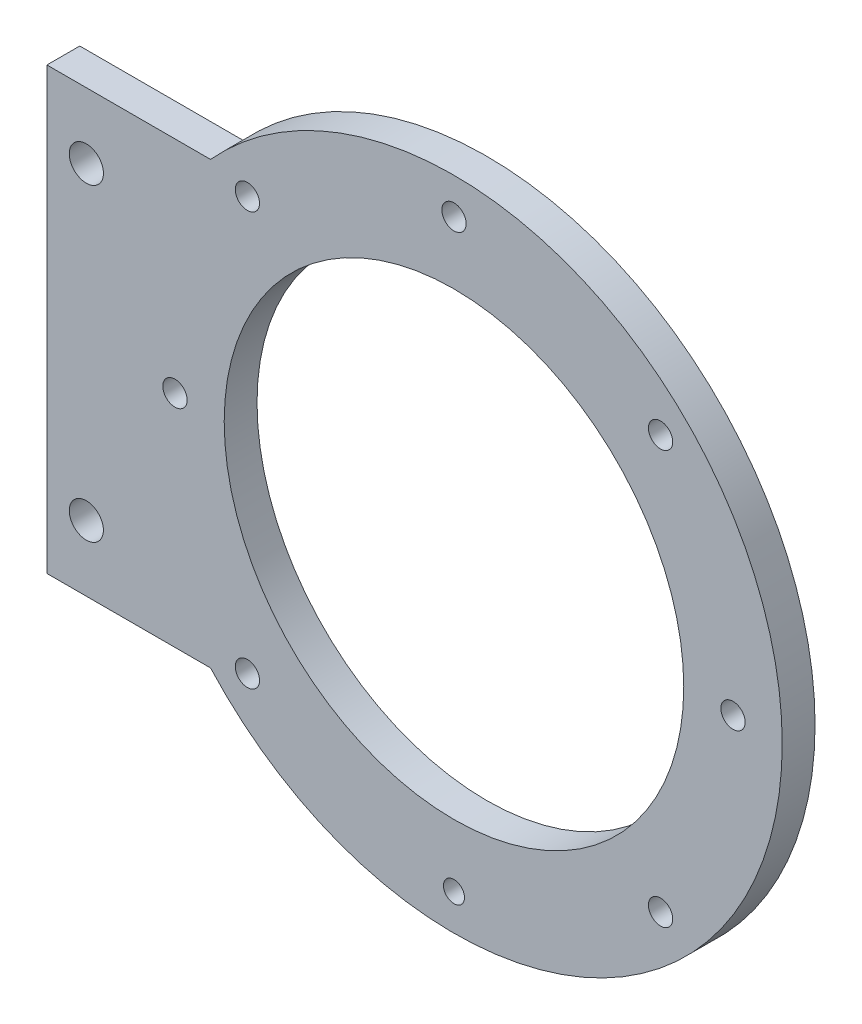
ISO-10303-21;
HEADER;
FILE_DESCRIPTION(('STEP AP214'),'2;1');
FILE_NAME('part.step','',(''),(''),'','','');
FILE_SCHEMA(('AUTOMOTIVE_DESIGN { 1 0 10303 214 1 1 1 1 }'));
ENDSEC;
DATA;
#1=APPLICATION_CONTEXT('core data for automotive mechanical design processes');
#2=APPLICATION_PROTOCOL_DEFINITION('international standard','automotive_design',2000,#1);
#3=PRODUCT_CONTEXT('',#1,'mechanical');
#4=PRODUCT('Part','Part','',(#3));
#5=PRODUCT_RELATED_PRODUCT_CATEGORY('part','',(#4));
#6=PRODUCT_DEFINITION_FORMATION('','',#4);
#7=PRODUCT_DEFINITION_CONTEXT('part definition',#1,'design');
#8=PRODUCT_DEFINITION('design','',#6,#7);
#9=PRODUCT_DEFINITION_SHAPE('','',#8);
#10=(LENGTH_UNIT() NAMED_UNIT(*) SI_UNIT(.MILLI.,.METRE.));
#11=(NAMED_UNIT(*) PLANE_ANGLE_UNIT() SI_UNIT($,.RADIAN.));
#12=(NAMED_UNIT(*) SI_UNIT($,.STERADIAN.) SOLID_ANGLE_UNIT());
#13=UNCERTAINTY_MEASURE_WITH_UNIT(LENGTH_MEASURE(1.E-05),#10,'distance_accuracy_value','');
#14=(GEOMETRIC_REPRESENTATION_CONTEXT(3) GLOBAL_UNCERTAINTY_ASSIGNED_CONTEXT((#13)) GLOBAL_UNIT_ASSIGNED_CONTEXT((#10,
#11,#12)) REPRESENTATION_CONTEXT('',''));
#15=CARTESIAN_POINT('',(0.,0.,0.));
#16=DIRECTION('',(0.,0.,1.));
#17=DIRECTION('',(1.,0.,0.));
#18=AXIS2_PLACEMENT_3D('',#15,#16,#17);
#19=CARTESIAN_POINT('',(0.,0.,5.));
#20=DIRECTION('',(0.,1.,0.));
#21=DIRECTION('',(0.,0.,1.));
#22=AXIS2_PLACEMENT_3D('',#19,#20,#21);
#23=PLANE('',#22);
#24=DIRECTION('',(1.,0.,0.));
#25=VECTOR('',#24,1.);
#26=CARTESIAN_POINT('',(0.,0.,0.));
#27=LINE('',#26,#25);
#28=CARTESIAN_POINT('',(-12.,0.,0.));
#29=VERTEX_POINT('',#28);
#30=CARTESIAN_POINT('',(12.9190075645217,0.,0.));
#31=VERTEX_POINT('',#30);
#32=EDGE_CURVE('E117',#29,#31,#27,.T.);
#33=ORIENTED_EDGE('',*,*,#32,.F.);
#34=DIRECTION('',(0.,0.,-1.));
#35=VECTOR('',#34,1.);
#36=CARTESIAN_POINT('',(-12.,0.,5.));
#37=LINE('',#36,#35);
#38=CARTESIAN_POINT('',(-12.,0.,5.));
#39=VERTEX_POINT('',#38);
#40=EDGE_CURVE('E11',#39,#29,#37,.T.);
#41=ORIENTED_EDGE('',*,*,#40,.F.);
#42=DIRECTION('',(1.,0.,0.));
#43=VECTOR('',#42,1.);
#44=CARTESIAN_POINT('',(0.,0.,5.));
#45=LINE('',#44,#43);
#46=CARTESIAN_POINT('',(12.9190075645217,0.,5.));
#47=VERTEX_POINT('',#46);
#48=EDGE_CURVE('E104',#39,#47,#45,.T.);
#49=ORIENTED_EDGE('',*,*,#48,.T.);
#50=DIRECTION('',(0.,0.,-1.));
#51=VECTOR('',#50,1.);
#52=CARTESIAN_POINT('',(12.9190075645217,0.,5.));
#53=LINE('',#52,#51);
#54=EDGE_CURVE('E83',#47,#31,#53,.T.);
#55=ORIENTED_EDGE('',*,*,#54,.T.);
#56=EDGE_LOOP('',(#33,#41,#49,#55));
#57=FACE_BOUND('',#56,.T.);
#58=ADVANCED_FACE('F43',(#57),#23,.T.);
#59=CARTESIAN_POINT('',(-12.,0.,5.));
#60=DIRECTION('',(-1.,0.,0.));
#61=DIRECTION('',(0.,0.,1.));
#62=AXIS2_PLACEMENT_3D('',#59,#60,#61);
#63=PLANE('',#62);
#64=DIRECTION('',(0.,1.,0.));
#65=VECTOR('',#64,1.);
#66=CARTESIAN_POINT('',(-12.,0.,0.));
#67=LINE('',#66,#65);
#68=CARTESIAN_POINT('',(-12.,-67.0820393249937,0.));
#69=VERTEX_POINT('',#68);
#70=EDGE_CURVE('E96',#69,#29,#67,.T.);
#71=ORIENTED_EDGE('',*,*,#70,.F.);
#72=DIRECTION('',(0.,0.,-1.));
#73=VECTOR('',#72,1.);
#74=CARTESIAN_POINT('',(-12.,-67.0820393249937,5.));
#75=LINE('',#74,#73);
#76=CARTESIAN_POINT('',(-12.,-67.0820393249937,5.));
#77=VERTEX_POINT('',#76);
#78=EDGE_CURVE('E52',#77,#69,#75,.T.);
#79=ORIENTED_EDGE('',*,*,#78,.F.);
#80=DIRECTION('',(0.,1.,0.));
#81=VECTOR('',#80,1.);
#82=CARTESIAN_POINT('',(-12.,0.,5.));
#83=LINE('',#82,#81);
#84=EDGE_CURVE('E94',#77,#39,#83,.T.);
#85=ORIENTED_EDGE('',*,*,#84,.T.);
#86=ORIENTED_EDGE('',*,*,#40,.T.);
#87=EDGE_LOOP('',(#71,#79,#85,#86));
#88=FACE_BOUND('',#87,.T.);
#89=ADVANCED_FACE('F92',(#88),#63,.T.);
#90=CARTESIAN_POINT('',(0.,-67.0820393249937,5.));
#91=DIRECTION('',(0.,1.,0.));
#92=DIRECTION('',(0.,0.,1.));
#93=AXIS2_PLACEMENT_3D('',#90,#91,#92);
#94=PLANE('',#93);
#95=DIRECTION('',(1.,0.,0.));
#96=VECTOR('',#95,1.);
#97=CARTESIAN_POINT('',(0.,-67.0820393249937,0.));
#98=LINE('',#97,#96);
#99=CARTESIAN_POINT('',(12.9190075645217,-67.0820393249937,0.));
#100=VERTEX_POINT('',#99);
#101=EDGE_CURVE('E76',#69,#100,#98,.T.);
#102=ORIENTED_EDGE('',*,*,#101,.T.);
#103=DIRECTION('',(0.,0.,-1.));
#104=VECTOR('',#103,1.);
#105=CARTESIAN_POINT('',(12.9190075645217,-67.0820393249937,5.));
#106=LINE('',#105,#104);
#107=CARTESIAN_POINT('',(12.9190075645217,-67.0820393249937,5.));
#108=VERTEX_POINT('',#107);
#109=EDGE_CURVE('E97',#108,#100,#106,.T.);
#110=ORIENTED_EDGE('',*,*,#109,.F.);
#111=DIRECTION('',(1.,0.,0.));
#112=VECTOR('',#111,1.);
#113=CARTESIAN_POINT('',(0.,-67.0820393249937,5.));
#114=LINE('',#113,#112);
#115=EDGE_CURVE('E99',#77,#108,#114,.T.);
#116=ORIENTED_EDGE('',*,*,#115,.F.);
#117=ORIENTED_EDGE('',*,*,#78,.T.);
#118=EDGE_LOOP('',(#102,#110,#116,#117));
#119=FACE_BOUND('',#118,.T.);
#120=ADVANCED_FACE('F100',(#119),#94,.F.);
#121=CARTESIAN_POINT('',(-6.,-10.,5.));
#122=DIRECTION('',(0.,0.,-1.));
#123=DIRECTION('',(-1.,0.,0.));
#124=AXIS2_PLACEMENT_3D('',#121,#122,#123);
#125=CYLINDRICAL_SURFACE('',#124,2.6);
#126=CARTESIAN_POINT('',(-6.,-10.,5.));
#127=DIRECTION('',(0.,0.,1.));
#128=DIRECTION('',(1.,0.,0.));
#129=AXIS2_PLACEMENT_3D('',#126,#127,#128);
#130=CIRCLE('',#129,2.6);
#131=CARTESIAN_POINT('',(-3.4,-10.,5.));
#132=VERTEX_POINT('',#131);
#133=EDGE_CURVE('E111',#132,#132,#130,.T.);
#134=ORIENTED_EDGE('',*,*,#133,.T.);
#135=EDGE_LOOP('',(#134));
#136=FACE_BOUND('',#135,.T.);
#137=CARTESIAN_POINT('',(-6.,-10.,0.));
#138=DIRECTION('',(0.,0.,1.));
#139=DIRECTION('',(1.,0.,0.));
#140=AXIS2_PLACEMENT_3D('',#137,#138,#139);
#141=CIRCLE('',#140,2.6);
#142=CARTESIAN_POINT('',(-3.4,-10.,0.));
#143=VERTEX_POINT('',#142);
#144=EDGE_CURVE('E125',#143,#143,#141,.T.);
#145=ORIENTED_EDGE('',*,*,#144,.F.);
#146=EDGE_LOOP('',(#145));
#147=FACE_BOUND('',#146,.T.);
#148=ADVANCED_FACE('F205',(#136,#147),#125,.F.);
#149=CARTESIAN_POINT('',(50.,-33.5410196624969,5.));
#150=DIRECTION('',(0.,0.,-1.));
#151=DIRECTION('',(-1.,0.,0.));
#152=AXIS2_PLACEMENT_3D('',#149,#150,#151);
#153=CYLINDRICAL_SURFACE('',#152,50.);
#154=CARTESIAN_POINT('',(50.,-33.5410196624969,0.));
#155=DIRECTION('',(0.,0.,1.));
#156=DIRECTION('',(1.,0.,0.));
#157=AXIS2_PLACEMENT_3D('',#154,#155,#156);
#158=CIRCLE('',#157,50.);
#159=EDGE_CURVE('E123',#100,#31,#158,.T.);
#160=ORIENTED_EDGE('',*,*,#159,.T.);
#161=ORIENTED_EDGE('',*,*,#54,.F.);
#162=CARTESIAN_POINT('',(50.,-33.5410196624969,5.));
#163=DIRECTION('',(0.,0.,1.));
#164=DIRECTION('',(1.,0.,0.));
#165=AXIS2_PLACEMENT_3D('',#162,#163,#164);
#166=CIRCLE('',#165,50.);
#167=EDGE_CURVE('E61',#108,#47,#166,.T.);
#168=ORIENTED_EDGE('',*,*,#167,.F.);
#169=ORIENTED_EDGE('',*,*,#109,.T.);
#170=EDGE_LOOP('',(#160,#161,#168,#169));
#171=FACE_BOUND('',#170,.T.);
#172=ADVANCED_FACE('F192',(#171),#153,.T.);
#173=CARTESIAN_POINT('',(-6.,-57.0820393249937,5.));
#174=DIRECTION('',(0.,0.,-1.));
#175=DIRECTION('',(-1.,0.,0.));
#176=AXIS2_PLACEMENT_3D('',#173,#174,#175);
#177=CYLINDRICAL_SURFACE('',#176,2.6);
#178=CARTESIAN_POINT('',(-6.,-57.0820393249937,5.));
#179=DIRECTION('',(0.,0.,1.));
#180=DIRECTION('',(1.,0.,0.));
#181=AXIS2_PLACEMENT_3D('',#178,#179,#180);
#182=CIRCLE('',#181,2.6);
#183=CARTESIAN_POINT('',(-3.4,-57.0820393249937,5.));
#184=VERTEX_POINT('',#183);
#185=EDGE_CURVE('E114',#184,#184,#182,.T.);
#186=ORIENTED_EDGE('',*,*,#185,.T.);
#187=EDGE_LOOP('',(#186));
#188=FACE_BOUND('',#187,.T.);
#189=CARTESIAN_POINT('',(-6.,-57.0820393249937,0.));
#190=DIRECTION('',(0.,0.,1.));
#191=DIRECTION('',(1.,0.,0.));
#192=AXIS2_PLACEMENT_3D('',#189,#190,#191);
#193=CIRCLE('',#192,2.6);
#194=CARTESIAN_POINT('',(-3.4,-57.0820393249937,0.));
#195=VERTEX_POINT('',#194);
#196=EDGE_CURVE('E106',#195,#195,#193,.T.);
#197=ORIENTED_EDGE('',*,*,#196,.F.);
#198=EDGE_LOOP('',(#197));
#199=FACE_BOUND('',#198,.T.);
#200=ADVANCED_FACE('F183',(#188,#199),#177,.F.);
#201=CARTESIAN_POINT('',(0.,0.,5.));
#202=DIRECTION('',(0.,0.,1.));
#203=DIRECTION('',(1.,0.,0.));
#204=AXIS2_PLACEMENT_3D('',#201,#202,#203);
#205=PLANE('',#204);
#206=CARTESIAN_POINT('',(50.,10.9589803375031,5.));
#207=DIRECTION('',(0.,0.,1.));
#208=DIRECTION('',(1.,0.,0.));
#209=AXIS2_PLACEMENT_3D('',#206,#207,#208);
#210=CIRCLE('',#209,1.85);
#211=CARTESIAN_POINT('',(51.85,10.9589803375031,5.));
#212=VERTEX_POINT('',#211);
#213=EDGE_CURVE('E136',#212,#212,#210,.T.);
#214=ORIENTED_EDGE('',*,*,#213,.F.);
#215=EDGE_LOOP('',(#214));
#216=FACE_BOUND('',#215,.T.);
#217=CARTESIAN_POINT('',(81.4662517628014,-65.0072714252982,5.));
#218=DIRECTION('',(0.,0.,1.));
#219=DIRECTION('',(1.,0.,0.));
#220=AXIS2_PLACEMENT_3D('',#217,#218,#219);
#221=CIRCLE('',#220,1.85000000000001);
#222=CARTESIAN_POINT('',(83.3162517628014,-65.0072714252982,5.));
#223=VERTEX_POINT('',#222);
#224=EDGE_CURVE('E364',#223,#223,#221,.T.);
#225=ORIENTED_EDGE('',*,*,#224,.F.);
#226=EDGE_LOOP('',(#225));
#227=FACE_BOUND('',#226,.T.);
#228=CARTESIAN_POINT('',(50.,-78.0410196624969,5.));
#229=DIRECTION('',(0.,0.,1.));
#230=DIRECTION('',(1.,0.,0.));
#231=AXIS2_PLACEMENT_3D('',#228,#229,#230);
#232=CIRCLE('',#231,1.6);
#233=CARTESIAN_POINT('',(51.6,-78.0410196624969,5.));
#234=VERTEX_POINT('',#233);
#235=EDGE_CURVE('E358',#234,#234,#232,.T.);
#236=ORIENTED_EDGE('',*,*,#235,.F.);
#237=EDGE_LOOP('',(#236));
#238=FACE_BOUND('',#237,.T.);
#239=CARTESIAN_POINT('',(18.5337482371986,-2.07476789969549,5.));
#240=DIRECTION('',(0.,0.,1.));
#241=DIRECTION('',(1.,0.,0.));
#242=AXIS2_PLACEMENT_3D('',#239,#240,#241);
#243=CIRCLE('',#242,1.85);
#244=CARTESIAN_POINT('',(20.3837482371986,-2.07476789969549,5.));
#245=VERTEX_POINT('',#244);
#246=EDGE_CURVE('E361',#245,#245,#243,.T.);
#247=ORIENTED_EDGE('',*,*,#246,.F.);
#248=EDGE_LOOP('',(#247));
#249=FACE_BOUND('',#248,.T.);
#250=CARTESIAN_POINT('',(81.4662517628014,-2.07476789969549,5.));
#251=DIRECTION('',(0.,0.,1.));
#252=DIRECTION('',(1.,0.,0.));
#253=AXIS2_PLACEMENT_3D('',#250,#251,#252);
#254=CIRCLE('',#253,1.85);
#255=CARTESIAN_POINT('',(83.3162517628014,-2.07476789969549,5.));
#256=VERTEX_POINT('',#255);
#257=EDGE_CURVE('E368',#256,#256,#254,.T.);
#258=ORIENTED_EDGE('',*,*,#257,.F.);
#259=EDGE_LOOP('',(#258));
#260=FACE_BOUND('',#259,.T.);
#261=CARTESIAN_POINT('',(18.5337482371987,-65.0072714252982,5.));
#262=DIRECTION('',(0.,0.,1.));
#263=DIRECTION('',(1.,0.,0.));
#264=AXIS2_PLACEMENT_3D('',#261,#262,#263);
#265=CIRCLE('',#264,1.85);
#266=CARTESIAN_POINT('',(20.3837482371987,-65.0072714252982,5.));
#267=VERTEX_POINT('',#266);
#268=EDGE_CURVE('E367',#267,#267,#265,.T.);
#269=ORIENTED_EDGE('',*,*,#268,.F.);
#270=EDGE_LOOP('',(#269));
#271=FACE_BOUND('',#270,.T.);
#272=CARTESIAN_POINT('',(50.,-33.5410196624969,5.));
#273=DIRECTION('',(0.,0.,1.));
#274=DIRECTION('',(1.,0.,0.));
#275=AXIS2_PLACEMENT_3D('',#272,#273,#274);
#276=CIRCLE('',#275,35.);
#277=CARTESIAN_POINT('',(85.,-33.5410196624969,5.));
#278=VERTEX_POINT('',#277);
#279=EDGE_CURVE('E149',#278,#278,#276,.T.);
#280=ORIENTED_EDGE('',*,*,#279,.F.);
#281=EDGE_LOOP('',(#280));
#282=FACE_BOUND('',#281,.T.);
#283=CARTESIAN_POINT('',(92.5,-33.5410196624969,5.));
#284=DIRECTION('',(0.,0.,1.));
#285=DIRECTION('',(1.,0.,0.));
#286=AXIS2_PLACEMENT_3D('',#283,#284,#285);
#287=CIRCLE('',#286,1.85000000000001);
#288=CARTESIAN_POINT('',(94.35,-33.5410196624969,5.));
#289=VERTEX_POINT('',#288);
#290=EDGE_CURVE('E164',#289,#289,#287,.T.);
#291=ORIENTED_EDGE('',*,*,#290,.F.);
#292=EDGE_LOOP('',(#291));
#293=FACE_BOUND('',#292,.T.);
#294=CARTESIAN_POINT('',(7.50000000000001,-33.5410196624969,5.));
#295=DIRECTION('',(0.,0.,1.));
#296=DIRECTION('',(1.,0.,0.));
#297=AXIS2_PLACEMENT_3D('',#294,#295,#296);
#298=CIRCLE('',#297,1.85);
#299=CARTESIAN_POINT('',(9.35000000000001,-33.5410196624969,5.));
#300=VERTEX_POINT('',#299);
#301=EDGE_CURVE('E167',#300,#300,#298,.T.);
#302=ORIENTED_EDGE('',*,*,#301,.F.);
#303=EDGE_LOOP('',(#302));
#304=FACE_BOUND('',#303,.T.);
#305=ORIENTED_EDGE('',*,*,#48,.F.);
#306=ORIENTED_EDGE('',*,*,#84,.F.);
#307=ORIENTED_EDGE('',*,*,#115,.T.);
#308=ORIENTED_EDGE('',*,*,#167,.T.);
#309=EDGE_LOOP('',(#305,#306,#307,#308));
#310=FACE_BOUND('',#309,.T.);
#311=ORIENTED_EDGE('',*,*,#133,.F.);
#312=EDGE_LOOP('',(#311));
#313=FACE_BOUND('',#312,.T.);
#314=ORIENTED_EDGE('',*,*,#185,.F.);
#315=EDGE_LOOP('',(#314));
#316=FACE_BOUND('',#315,.T.);
#317=ADVANCED_FACE('F102',(#216,#227,#238,#249,#260,#271,#282,#293,#304,#310,#313,#316),#205,.T.);
#318=CARTESIAN_POINT('',(0.,0.,0.));
#319=DIRECTION('',(0.,0.,1.));
#320=DIRECTION('',(1.,0.,0.));
#321=AXIS2_PLACEMENT_3D('',#318,#319,#320);
#322=PLANE('',#321);
#323=CARTESIAN_POINT('',(50.,10.9589803375031,0.));
#324=DIRECTION('',(0.,0.,1.));
#325=DIRECTION('',(1.,0.,0.));
#326=AXIS2_PLACEMENT_3D('',#323,#324,#325);
#327=CIRCLE('',#326,1.85);
#328=CARTESIAN_POINT('',(51.85,10.9589803375031,0.));
#329=VERTEX_POINT('',#328);
#330=EDGE_CURVE('E46',#329,#329,#327,.T.);
#331=ORIENTED_EDGE('',*,*,#330,.T.);
#332=EDGE_LOOP('',(#331));
#333=FACE_BOUND('',#332,.T.);
#334=CARTESIAN_POINT('',(81.4662517628014,-65.0072714252982,0.));
#335=DIRECTION('',(0.,0.,1.));
#336=DIRECTION('',(1.,0.,0.));
#337=AXIS2_PLACEMENT_3D('',#334,#335,#336);
#338=CIRCLE('',#337,1.85000000000001);
#339=CARTESIAN_POINT('',(83.3162517628014,-65.0072714252982,0.));
#340=VERTEX_POINT('',#339);
#341=EDGE_CURVE('E144',#340,#340,#338,.T.);
#342=ORIENTED_EDGE('',*,*,#341,.T.);
#343=EDGE_LOOP('',(#342));
#344=FACE_BOUND('',#343,.T.);
#345=CARTESIAN_POINT('',(50.,-78.0410196624969,0.));
#346=DIRECTION('',(0.,0.,1.));
#347=DIRECTION('',(1.,0.,0.));
#348=AXIS2_PLACEMENT_3D('',#345,#346,#347);
#349=CIRCLE('',#348,1.6);
#350=CARTESIAN_POINT('',(51.6,-78.0410196624969,0.));
#351=VERTEX_POINT('',#350);
#352=EDGE_CURVE('E142',#351,#351,#349,.T.);
#353=ORIENTED_EDGE('',*,*,#352,.T.);
#354=EDGE_LOOP('',(#353));
#355=FACE_BOUND('',#354,.T.);
#356=CARTESIAN_POINT('',(18.5337482371986,-2.07476789969549,0.));
#357=DIRECTION('',(0.,0.,1.));
#358=DIRECTION('',(1.,0.,0.));
#359=AXIS2_PLACEMENT_3D('',#356,#357,#358);
#360=CIRCLE('',#359,1.85);
#361=CARTESIAN_POINT('',(20.3837482371986,-2.07476789969549,0.));
#362=VERTEX_POINT('',#361);
#363=EDGE_CURVE('E139',#362,#362,#360,.T.);
#364=ORIENTED_EDGE('',*,*,#363,.T.);
#365=EDGE_LOOP('',(#364));
#366=FACE_BOUND('',#365,.T.);
#367=CARTESIAN_POINT('',(81.4662517628014,-2.07476789969549,0.));
#368=DIRECTION('',(0.,0.,1.));
#369=DIRECTION('',(1.,0.,0.));
#370=AXIS2_PLACEMENT_3D('',#367,#368,#369);
#371=CIRCLE('',#370,1.85);
#372=CARTESIAN_POINT('',(83.3162517628014,-2.07476789969549,0.));
#373=VERTEX_POINT('',#372);
#374=EDGE_CURVE('E135',#373,#373,#371,.T.);
#375=ORIENTED_EDGE('',*,*,#374,.T.);
#376=EDGE_LOOP('',(#375));
#377=FACE_BOUND('',#376,.T.);
#378=CARTESIAN_POINT('',(18.5337482371987,-65.0072714252982,0.));
#379=DIRECTION('',(0.,0.,1.));
#380=DIRECTION('',(1.,0.,0.));
#381=AXIS2_PLACEMENT_3D('',#378,#379,#380);
#382=CIRCLE('',#381,1.85);
#383=CARTESIAN_POINT('',(20.3837482371987,-65.0072714252982,0.));
#384=VERTEX_POINT('',#383);
#385=EDGE_CURVE('E132',#384,#384,#382,.T.);
#386=ORIENTED_EDGE('',*,*,#385,.T.);
#387=EDGE_LOOP('',(#386));
#388=FACE_BOUND('',#387,.T.);
#389=CARTESIAN_POINT('',(50.,-33.5410196624969,0.));
#390=DIRECTION('',(0.,0.,1.));
#391=DIRECTION('',(1.,0.,0.));
#392=AXIS2_PLACEMENT_3D('',#389,#390,#391);
#393=CIRCLE('',#392,35.);
#394=CARTESIAN_POINT('',(85.,-33.5410196624969,0.));
#395=VERTEX_POINT('',#394);
#396=EDGE_CURVE('E153',#395,#395,#393,.T.);
#397=ORIENTED_EDGE('',*,*,#396,.T.);
#398=EDGE_LOOP('',(#397));
#399=FACE_BOUND('',#398,.T.);
#400=CARTESIAN_POINT('',(92.5,-33.5410196624969,0.));
#401=DIRECTION('',(0.,0.,1.));
#402=DIRECTION('',(1.,0.,0.));
#403=AXIS2_PLACEMENT_3D('',#400,#401,#402);
#404=CIRCLE('',#403,1.85000000000001);
#405=CARTESIAN_POINT('',(94.35,-33.5410196624969,0.));
#406=VERTEX_POINT('',#405);
#407=EDGE_CURVE('E120',#406,#406,#404,.T.);
#408=ORIENTED_EDGE('',*,*,#407,.T.);
#409=EDGE_LOOP('',(#408));
#410=FACE_BOUND('',#409,.T.);
#411=CARTESIAN_POINT('',(7.50000000000001,-33.5410196624969,0.));
#412=DIRECTION('',(0.,0.,1.));
#413=DIRECTION('',(1.,0.,0.));
#414=AXIS2_PLACEMENT_3D('',#411,#412,#413);
#415=CIRCLE('',#414,1.85);
#416=CARTESIAN_POINT('',(9.35000000000001,-33.5410196624969,0.));
#417=VERTEX_POINT('',#416);
#418=EDGE_CURVE('E158',#417,#417,#415,.T.);
#419=ORIENTED_EDGE('',*,*,#418,.T.);
#420=EDGE_LOOP('',(#419));
#421=FACE_BOUND('',#420,.T.);
#422=ORIENTED_EDGE('',*,*,#32,.T.);
#423=ORIENTED_EDGE('',*,*,#159,.F.);
#424=ORIENTED_EDGE('',*,*,#101,.F.);
#425=ORIENTED_EDGE('',*,*,#70,.T.);
#426=EDGE_LOOP('',(#422,#423,#424,#425));
#427=FACE_BOUND('',#426,.T.);
#428=ORIENTED_EDGE('',*,*,#144,.T.);
#429=EDGE_LOOP('',(#428));
#430=FACE_BOUND('',#429,.T.);
#431=ORIENTED_EDGE('',*,*,#196,.T.);
#432=EDGE_LOOP('',(#431));
#433=FACE_BOUND('',#432,.T.);
#434=ADVANCED_FACE('F172',(#333,#344,#355,#366,#377,#388,#399,#410,#421,#427,#430,#433),#322,.F.);
#435=CARTESIAN_POINT('',(7.50000000000001,-33.5410196624969,0.));
#436=DIRECTION('',(0.,0.,1.));
#437=DIRECTION('',(1.,0.,0.));
#438=AXIS2_PLACEMENT_3D('',#435,#436,#437);
#439=CYLINDRICAL_SURFACE('',#438,1.85);
#440=ORIENTED_EDGE('',*,*,#418,.F.);
#441=EDGE_LOOP('',(#440));
#442=FACE_BOUND('',#441,.T.);
#443=ORIENTED_EDGE('',*,*,#301,.T.);
#444=EDGE_LOOP('',(#443));
#445=FACE_BOUND('',#444,.T.);
#446=ADVANCED_FACE('F175',(#442,#445),#439,.F.);
#447=CARTESIAN_POINT('',(92.5,-33.5410196624969,0.));
#448=DIRECTION('',(0.,0.,1.));
#449=DIRECTION('',(1.,0.,0.));
#450=AXIS2_PLACEMENT_3D('',#447,#448,#449);
#451=CYLINDRICAL_SURFACE('',#450,1.85000000000001);
#452=ORIENTED_EDGE('',*,*,#407,.F.);
#453=EDGE_LOOP('',(#452));
#454=FACE_BOUND('',#453,.T.);
#455=ORIENTED_EDGE('',*,*,#290,.T.);
#456=EDGE_LOOP('',(#455));
#457=FACE_BOUND('',#456,.T.);
#458=ADVANCED_FACE('F178',(#454,#457),#451,.F.);
#459=CARTESIAN_POINT('',(50.,-33.5410196624969,0.));
#460=DIRECTION('',(0.,0.,1.));
#461=DIRECTION('',(1.,0.,0.));
#462=AXIS2_PLACEMENT_3D('',#459,#460,#461);
#463=CYLINDRICAL_SURFACE('',#462,35.);
#464=ORIENTED_EDGE('',*,*,#396,.F.);
#465=EDGE_LOOP('',(#464));
#466=FACE_BOUND('',#465,.T.);
#467=ORIENTED_EDGE('',*,*,#279,.T.);
#468=EDGE_LOOP('',(#467));
#469=FACE_BOUND('',#468,.T.);
#470=ADVANCED_FACE('F285',(#466,#469),#463,.F.);
#471=CARTESIAN_POINT('',(18.5337482371987,-65.0072714252982,-5.));
#472=DIRECTION('',(0.,0.,1.));
#473=DIRECTION('',(1.,0.,0.));
#474=AXIS2_PLACEMENT_3D('',#471,#472,#473);
#475=CYLINDRICAL_SURFACE('',#474,1.85);
#476=ORIENTED_EDGE('',*,*,#268,.T.);
#477=EDGE_LOOP('',(#476));
#478=FACE_BOUND('',#477,.T.);
#479=ORIENTED_EDGE('',*,*,#385,.F.);
#480=EDGE_LOOP('',(#479));
#481=FACE_BOUND('',#480,.T.);
#482=ADVANCED_FACE('F294',(#478,#481),#475,.F.);
#483=CARTESIAN_POINT('',(81.4662517628014,-2.07476789969549,-5.));
#484=DIRECTION('',(0.,0.,1.));
#485=DIRECTION('',(1.,0.,0.));
#486=AXIS2_PLACEMENT_3D('',#483,#484,#485);
#487=CYLINDRICAL_SURFACE('',#486,1.85);
#488=ORIENTED_EDGE('',*,*,#257,.T.);
#489=EDGE_LOOP('',(#488));
#490=FACE_BOUND('',#489,.T.);
#491=ORIENTED_EDGE('',*,*,#374,.F.);
#492=EDGE_LOOP('',(#491));
#493=FACE_BOUND('',#492,.T.);
#494=ADVANCED_FACE('F303',(#490,#493),#487,.F.);
#495=CARTESIAN_POINT('',(18.5337482371986,-2.07476789969549,-5.));
#496=DIRECTION('',(0.,0.,1.));
#497=DIRECTION('',(1.,0.,0.));
#498=AXIS2_PLACEMENT_3D('',#495,#496,#497);
#499=CYLINDRICAL_SURFACE('',#498,1.85);
#500=ORIENTED_EDGE('',*,*,#246,.T.);
#501=EDGE_LOOP('',(#500));
#502=FACE_BOUND('',#501,.T.);
#503=ORIENTED_EDGE('',*,*,#363,.F.);
#504=EDGE_LOOP('',(#503));
#505=FACE_BOUND('',#504,.T.);
#506=ADVANCED_FACE('F313',(#502,#505),#499,.F.);
#507=CARTESIAN_POINT('',(50.,-78.0410196624969,-5.));
#508=DIRECTION('',(0.,0.,1.));
#509=DIRECTION('',(1.,0.,0.));
#510=AXIS2_PLACEMENT_3D('',#507,#508,#509);
#511=CYLINDRICAL_SURFACE('',#510,1.6);
#512=ORIENTED_EDGE('',*,*,#235,.T.);
#513=EDGE_LOOP('',(#512));
#514=FACE_BOUND('',#513,.T.);
#515=ORIENTED_EDGE('',*,*,#352,.F.);
#516=EDGE_LOOP('',(#515));
#517=FACE_BOUND('',#516,.T.);
#518=ADVANCED_FACE('F323',(#514,#517),#511,.F.);
#519=CARTESIAN_POINT('',(81.4662517628014,-65.0072714252982,-5.));
#520=DIRECTION('',(0.,0.,1.));
#521=DIRECTION('',(1.,0.,0.));
#522=AXIS2_PLACEMENT_3D('',#519,#520,#521);
#523=CYLINDRICAL_SURFACE('',#522,1.85000000000001);
#524=ORIENTED_EDGE('',*,*,#224,.T.);
#525=EDGE_LOOP('',(#524));
#526=FACE_BOUND('',#525,.T.);
#527=ORIENTED_EDGE('',*,*,#341,.F.);
#528=EDGE_LOOP('',(#527));
#529=FACE_BOUND('',#528,.T.);
#530=ADVANCED_FACE('F333',(#526,#529),#523,.F.);
#531=CARTESIAN_POINT('',(50.,10.9589803375031,-5.));
#532=DIRECTION('',(0.,0.,1.));
#533=DIRECTION('',(1.,0.,0.));
#534=AXIS2_PLACEMENT_3D('',#531,#532,#533);
#535=CYLINDRICAL_SURFACE('',#534,1.85);
#536=ORIENTED_EDGE('',*,*,#213,.T.);
#537=EDGE_LOOP('',(#536));
#538=FACE_BOUND('',#537,.T.);
#539=ORIENTED_EDGE('',*,*,#330,.F.);
#540=EDGE_LOOP('',(#539));
#541=FACE_BOUND('',#540,.T.);
#542=ADVANCED_FACE('F343',(#538,#541),#535,.F.);
#543=CLOSED_SHELL('',(#58,#89,#120,#148,#172,#200,#317,#434,#446,#458,#470,#482,#494,#506,#518,
#530,#542));
#544=MANIFOLD_SOLID_BREP('B2',#543);
#545=ADVANCED_BREP_SHAPE_REPRESENTATION('',(#18,#544),#14);
#546=SHAPE_DEFINITION_REPRESENTATION(#9,#545);
ENDSEC;
END-ISO-10303-21;
